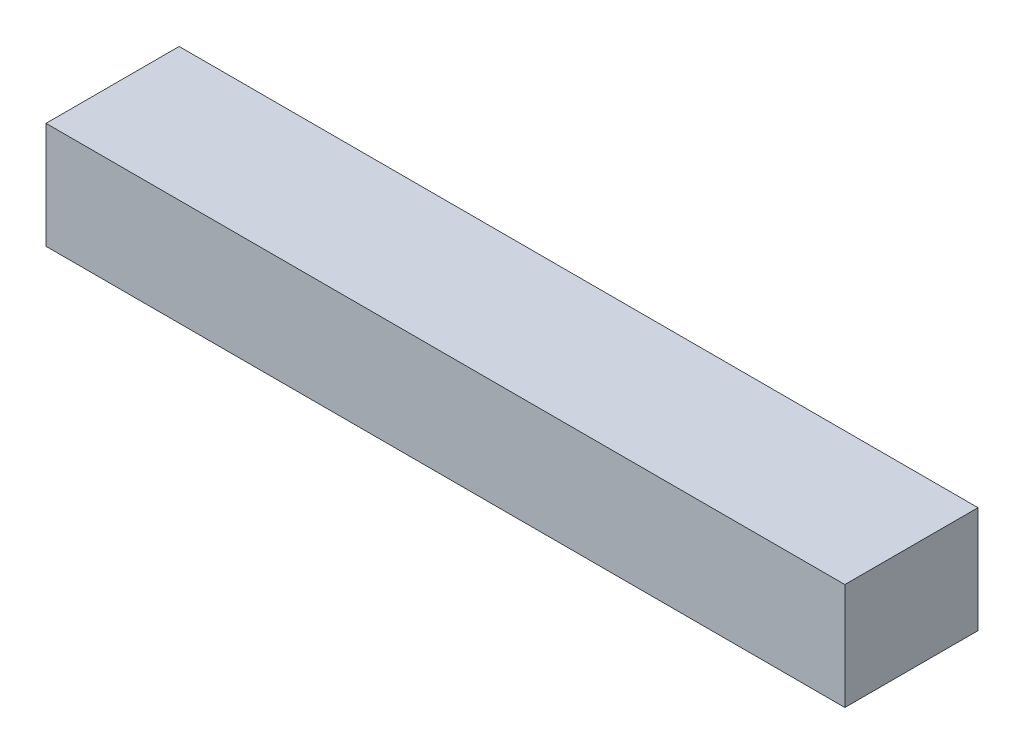
ISO-10303-21;
HEADER;
FILE_DESCRIPTION(('STEP AP214'),'2;1');
FILE_NAME('part.step','',(''),(''),'','','');
FILE_SCHEMA(('AUTOMOTIVE_DESIGN { 1 0 10303 214 1 1 1 1 }'));
ENDSEC;
DATA;
#1=APPLICATION_CONTEXT('core data for automotive mechanical design processes');
#2=APPLICATION_PROTOCOL_DEFINITION('international standard','automotive_design',2000,#1);
#3=PRODUCT_CONTEXT('',#1,'mechanical');
#4=PRODUCT('Part','Part','',(#3));
#5=PRODUCT_RELATED_PRODUCT_CATEGORY('part','',(#4));
#6=PRODUCT_DEFINITION_FORMATION('','',#4);
#7=PRODUCT_DEFINITION_CONTEXT('part definition',#1,'design');
#8=PRODUCT_DEFINITION('design','',#6,#7);
#9=PRODUCT_DEFINITION_SHAPE('','',#8);
#10=(LENGTH_UNIT() NAMED_UNIT(*) SI_UNIT(.MILLI.,.METRE.));
#11=(NAMED_UNIT(*) PLANE_ANGLE_UNIT() SI_UNIT($,.RADIAN.));
#12=(NAMED_UNIT(*) SI_UNIT($,.STERADIAN.) SOLID_ANGLE_UNIT());
#13=UNCERTAINTY_MEASURE_WITH_UNIT(LENGTH_MEASURE(1.E-05),#10,'distance_accuracy_value','');
#14=(GEOMETRIC_REPRESENTATION_CONTEXT(3) GLOBAL_UNCERTAINTY_ASSIGNED_CONTEXT((#13)) GLOBAL_UNIT_ASSIGNED_CONTEXT((#10,
#11,#12)) REPRESENTATION_CONTEXT('',''));
#15=CARTESIAN_POINT('',(0.,0.,0.));
#16=DIRECTION('',(0.,0.,1.));
#17=DIRECTION('',(1.,0.,0.));
#18=AXIS2_PLACEMENT_3D('',#15,#16,#17);
#19=CARTESIAN_POINT('',(0.,0.,500.));
#20=DIRECTION('',(1.,0.,0.));
#21=DIRECTION('',(0.,1.,0.));
#22=AXIS2_PLACEMENT_3D('',#19,#20,#21);
#23=PLANE('',#22);
#24=DIRECTION('',(0.,-1.,0.));
#25=VECTOR('',#24,1.);
#26=CARTESIAN_POINT('',(0.,0.,0.));
#27=LINE('',#26,#25);
#28=CARTESIAN_POINT('',(0.,0.,0.));
#29=VERTEX_POINT('',#28);
#30=CARTESIAN_POINT('',(0.,-400.,0.));
#31=VERTEX_POINT('',#30);
#32=EDGE_CURVE('E104',#29,#31,#27,.T.);
#33=ORIENTED_EDGE('',*,*,#32,.T.);
#34=DIRECTION('',(0.,0.,-1.));
#35=VECTOR('',#34,1.);
#36=CARTESIAN_POINT('',(0.,-400.,500.));
#37=LINE('',#36,#35);
#38=CARTESIAN_POINT('',(0.,-400.,500.));
#39=VERTEX_POINT('',#38);
#40=EDGE_CURVE('E95',#39,#31,#37,.T.);
#41=ORIENTED_EDGE('',*,*,#40,.F.);
#42=DIRECTION('',(0.,-1.,0.));
#43=VECTOR('',#42,1.);
#44=CARTESIAN_POINT('',(0.,0.,500.));
#45=LINE('',#44,#43);
#46=CARTESIAN_POINT('',(0.,0.,500.));
#47=VERTEX_POINT('',#46);
#48=EDGE_CURVE('E89',#47,#39,#45,.T.);
#49=ORIENTED_EDGE('',*,*,#48,.F.);
#50=DIRECTION('',(0.,0.,-1.));
#51=VECTOR('',#50,1.);
#52=CARTESIAN_POINT('',(0.,0.,500.));
#53=LINE('',#52,#51);
#54=EDGE_CURVE('E100',#47,#29,#53,.T.);
#55=ORIENTED_EDGE('',*,*,#54,.T.);
#56=EDGE_LOOP('',(#33,#41,#49,#55));
#57=FACE_BOUND('',#56,.T.);
#58=ADVANCED_FACE('F37',(#57),#23,.F.);
#59=CARTESIAN_POINT('',(0.,-400.,500.));
#60=DIRECTION('',(0.,1.,0.));
#61=DIRECTION('',(0.,0.,1.));
#62=AXIS2_PLACEMENT_3D('',#59,#60,#61);
#63=PLANE('',#62);
#64=CARTESIAN_POINT('',(1500.,-400.,250.));
#65=DIRECTION('',(0.,1.,0.));
#66=DIRECTION('',(0.,0.,1.));
#67=AXIS2_PLACEMENT_3D('',#64,#65,#66);
#68=CIRCLE('',#67,101.6);
#69=CARTESIAN_POINT('',(1500.,-400.,351.6));
#70=VERTEX_POINT('',#69);
#71=EDGE_CURVE('E11',#70,#70,#68,.F.);
#72=ORIENTED_EDGE('',*,*,#71,.F.);
#73=EDGE_LOOP('',(#72));
#74=FACE_BOUND('',#73,.T.);
#75=CARTESIAN_POINT('',(500.,-400.,250.));
#76=DIRECTION('',(0.,1.,0.));
#77=DIRECTION('',(0.,0.,1.));
#78=AXIS2_PLACEMENT_3D('',#75,#76,#77);
#79=CIRCLE('',#78,101.6);
#80=CARTESIAN_POINT('',(500.,-400.,351.6));
#81=VERTEX_POINT('',#80);
#82=EDGE_CURVE('E45',#81,#81,#79,.F.);
#83=ORIENTED_EDGE('',*,*,#82,.F.);
#84=EDGE_LOOP('',(#83));
#85=FACE_BOUND('',#84,.T.);
#86=CARTESIAN_POINT('',(2500.,-400.,250.));
#87=DIRECTION('',(0.,1.,0.));
#88=DIRECTION('',(0.,0.,1.));
#89=AXIS2_PLACEMENT_3D('',#86,#87,#88);
#90=CIRCLE('',#89,101.6);
#91=CARTESIAN_POINT('',(2500.,-400.,351.6));
#92=VERTEX_POINT('',#91);
#93=EDGE_CURVE('E114',#92,#92,#90,.F.);
#94=ORIENTED_EDGE('',*,*,#93,.F.);
#95=EDGE_LOOP('',(#94));
#96=FACE_BOUND('',#95,.T.);
#97=DIRECTION('',(1.,0.,0.));
#98=VECTOR('',#97,1.);
#99=CARTESIAN_POINT('',(0.,-400.,0.));
#100=LINE('',#99,#98);
#101=CARTESIAN_POINT('',(3000.,-400.,0.));
#102=VERTEX_POINT('',#101);
#103=EDGE_CURVE('E94',#31,#102,#100,.T.);
#104=ORIENTED_EDGE('',*,*,#103,.T.);
#105=DIRECTION('',(0.,0.,-1.));
#106=VECTOR('',#105,1.);
#107=CARTESIAN_POINT('',(3000.,-400.,500.));
#108=LINE('',#107,#106);
#109=CARTESIAN_POINT('',(3000.,-400.,500.));
#110=VERTEX_POINT('',#109);
#111=EDGE_CURVE('E92',#110,#102,#108,.T.);
#112=ORIENTED_EDGE('',*,*,#111,.F.);
#113=DIRECTION('',(1.,0.,0.));
#114=VECTOR('',#113,1.);
#115=CARTESIAN_POINT('',(0.,-400.,500.));
#116=LINE('',#115,#114);
#117=EDGE_CURVE('E84',#39,#110,#116,.T.);
#118=ORIENTED_EDGE('',*,*,#117,.F.);
#119=ORIENTED_EDGE('',*,*,#40,.T.);
#120=EDGE_LOOP('',(#104,#112,#118,#119));
#121=FACE_BOUND('',#120,.T.);
#122=ADVANCED_FACE('F93',(#74,#85,#96,#121),#63,.F.);
#123=CARTESIAN_POINT('',(3000.,0.,500.));
#124=DIRECTION('',(-1.,0.,0.));
#125=DIRECTION('',(0.,0.,1.));
#126=AXIS2_PLACEMENT_3D('',#123,#124,#125);
#127=PLANE('',#126);
#128=DIRECTION('',(0.,1.,0.));
#129=VECTOR('',#128,1.);
#130=CARTESIAN_POINT('',(3000.,0.,0.));
#131=LINE('',#130,#129);
#132=CARTESIAN_POINT('',(3000.,0.,0.));
#133=VERTEX_POINT('',#132);
#134=EDGE_CURVE('E70',#102,#133,#131,.T.);
#135=ORIENTED_EDGE('',*,*,#134,.T.);
#136=DIRECTION('',(0.,0.,-1.));
#137=VECTOR('',#136,1.);
#138=CARTESIAN_POINT('',(3000.,0.,500.));
#139=LINE('',#138,#137);
#140=CARTESIAN_POINT('',(3000.,0.,500.));
#141=VERTEX_POINT('',#140);
#142=EDGE_CURVE('E96',#141,#133,#139,.T.);
#143=ORIENTED_EDGE('',*,*,#142,.F.);
#144=DIRECTION('',(0.,1.,0.));
#145=VECTOR('',#144,1.);
#146=CARTESIAN_POINT('',(3000.,0.,500.));
#147=LINE('',#146,#145);
#148=EDGE_CURVE('E87',#110,#141,#147,.T.);
#149=ORIENTED_EDGE('',*,*,#148,.F.);
#150=ORIENTED_EDGE('',*,*,#111,.T.);
#151=EDGE_LOOP('',(#135,#143,#149,#150));
#152=FACE_BOUND('',#151,.T.);
#153=ADVANCED_FACE('F98',(#152),#127,.F.);
#154=CARTESIAN_POINT('',(0.,0.,500.));
#155=DIRECTION('',(0.,-1.,0.));
#156=DIRECTION('',(0.,0.,-1.));
#157=AXIS2_PLACEMENT_3D('',#154,#155,#156);
#158=PLANE('',#157);
#159=DIRECTION('',(-1.,0.,0.));
#160=VECTOR('',#159,1.);
#161=CARTESIAN_POINT('',(0.,0.,0.));
#162=LINE('',#161,#160);
#163=EDGE_CURVE('E76',#133,#29,#162,.T.);
#164=ORIENTED_EDGE('',*,*,#163,.T.);
#165=ORIENTED_EDGE('',*,*,#54,.F.);
#166=DIRECTION('',(-1.,0.,0.));
#167=VECTOR('',#166,1.);
#168=CARTESIAN_POINT('',(0.,0.,500.));
#169=LINE('',#168,#167);
#170=EDGE_CURVE('E53',#141,#47,#169,.T.);
#171=ORIENTED_EDGE('',*,*,#170,.F.);
#172=ORIENTED_EDGE('',*,*,#142,.T.);
#173=EDGE_LOOP('',(#164,#165,#171,#172));
#174=FACE_BOUND('',#173,.T.);
#175=ADVANCED_FACE('F147',(#174),#158,.F.);
#176=CARTESIAN_POINT('',(0.,0.,500.));
#177=DIRECTION('',(0.,0.,1.));
#178=DIRECTION('',(1.,0.,0.));
#179=AXIS2_PLACEMENT_3D('',#176,#177,#178);
#180=PLANE('',#179);
#181=ORIENTED_EDGE('',*,*,#48,.T.);
#182=ORIENTED_EDGE('',*,*,#117,.T.);
#183=ORIENTED_EDGE('',*,*,#148,.T.);
#184=ORIENTED_EDGE('',*,*,#170,.T.);
#185=EDGE_LOOP('',(#181,#182,#183,#184));
#186=FACE_BOUND('',#185,.T.);
#187=ADVANCED_FACE('F85',(#186),#180,.T.);
#188=CARTESIAN_POINT('',(0.,0.,0.));
#189=DIRECTION('',(0.,0.,1.));
#190=DIRECTION('',(1.,0.,0.));
#191=AXIS2_PLACEMENT_3D('',#188,#189,#190);
#192=PLANE('',#191);
#193=ORIENTED_EDGE('',*,*,#32,.F.);
#194=ORIENTED_EDGE('',*,*,#163,.F.);
#195=ORIENTED_EDGE('',*,*,#134,.F.);
#196=ORIENTED_EDGE('',*,*,#103,.F.);
#197=EDGE_LOOP('',(#193,#194,#195,#196));
#198=FACE_BOUND('',#197,.T.);
#199=ADVANCED_FACE('F129',(#198),#192,.F.);
#200=CARTESIAN_POINT('',(2500.,-420.,250.));
#201=DIRECTION('',(0.,1.,0.));
#202=DIRECTION('',(0.,0.,1.));
#203=AXIS2_PLACEMENT_3D('',#200,#201,#202);
#204=CYLINDRICAL_SURFACE('',#203,101.6);
#205=CARTESIAN_POINT('',(2500.,-420.,250.));
#206=DIRECTION('',(0.,-1.,0.));
#207=DIRECTION('',(0.,0.,-1.));
#208=AXIS2_PLACEMENT_3D('',#205,#206,#207);
#209=CIRCLE('',#208,101.6);
#210=CARTESIAN_POINT('',(2500.,-420.,148.4));
#211=VERTEX_POINT('',#210);
#212=EDGE_CURVE('E107',#211,#211,#209,.T.);
#213=ORIENTED_EDGE('',*,*,#212,.F.);
#214=EDGE_LOOP('',(#213));
#215=FACE_BOUND('',#214,.T.);
#216=ORIENTED_EDGE('',*,*,#93,.T.);
#217=EDGE_LOOP('',(#216));
#218=FACE_BOUND('',#217,.T.);
#219=ADVANCED_FACE('F126',(#215,#218),#204,.T.);
#220=CARTESIAN_POINT('',(2500.,-420.,250.));
#221=DIRECTION('',(0.,-1.,0.));
#222=DIRECTION('',(0.,0.,-1.));
#223=AXIS2_PLACEMENT_3D('',#220,#221,#222);
#224=PLANE('',#223);
#225=ORIENTED_EDGE('',*,*,#212,.T.);
#226=EDGE_LOOP('',(#225));
#227=FACE_BOUND('',#226,.T.);
#228=ADVANCED_FACE('F128',(#227),#224,.T.);
#229=CARTESIAN_POINT('',(500.,-420.,250.));
#230=DIRECTION('',(0.,1.,0.));
#231=DIRECTION('',(0.,0.,1.));
#232=AXIS2_PLACEMENT_3D('',#229,#230,#231);
#233=CYLINDRICAL_SURFACE('',#232,101.6);
#234=CARTESIAN_POINT('',(500.,-420.,250.));
#235=DIRECTION('',(0.,-1.,0.));
#236=DIRECTION('',(0.,0.,-1.));
#237=AXIS2_PLACEMENT_3D('',#234,#235,#236);
#238=CIRCLE('',#237,101.6);
#239=CARTESIAN_POINT('',(500.,-420.,148.4));
#240=VERTEX_POINT('',#239);
#241=EDGE_CURVE('E222',#240,#240,#238,.T.);
#242=ORIENTED_EDGE('',*,*,#241,.F.);
#243=EDGE_LOOP('',(#242));
#244=FACE_BOUND('',#243,.T.);
#245=ORIENTED_EDGE('',*,*,#82,.T.);
#246=EDGE_LOOP('',(#245));
#247=FACE_BOUND('',#246,.T.);
#248=ADVANCED_FACE('F119',(#244,#247),#233,.T.);
#249=CARTESIAN_POINT('',(500.,-420.,250.));
#250=DIRECTION('',(0.,-1.,0.));
#251=DIRECTION('',(0.,0.,-1.));
#252=AXIS2_PLACEMENT_3D('',#249,#250,#251);
#253=PLANE('',#252);
#254=ORIENTED_EDGE('',*,*,#241,.T.);
#255=EDGE_LOOP('',(#254));
#256=FACE_BOUND('',#255,.T.);
#257=ADVANCED_FACE('F185',(#256),#253,.T.);
#258=CARTESIAN_POINT('',(1500.,-420.,250.));
#259=DIRECTION('',(0.,1.,0.));
#260=DIRECTION('',(0.,0.,1.));
#261=AXIS2_PLACEMENT_3D('',#258,#259,#260);
#262=CYLINDRICAL_SURFACE('',#261,101.6);
#263=CARTESIAN_POINT('',(1500.,-420.,250.));
#264=DIRECTION('',(0.,-1.,0.));
#265=DIRECTION('',(0.,0.,-1.));
#266=AXIS2_PLACEMENT_3D('',#263,#264,#265);
#267=CIRCLE('',#266,101.6);
#268=CARTESIAN_POINT('',(1500.,-420.,148.4));
#269=VERTEX_POINT('',#268);
#270=EDGE_CURVE('E221',#269,#269,#267,.T.);
#271=ORIENTED_EDGE('',*,*,#270,.F.);
#272=EDGE_LOOP('',(#271));
#273=FACE_BOUND('',#272,.T.);
#274=ORIENTED_EDGE('',*,*,#71,.T.);
#275=EDGE_LOOP('',(#274));
#276=FACE_BOUND('',#275,.T.);
#277=ADVANCED_FACE('F195',(#273,#276),#262,.T.);
#278=CARTESIAN_POINT('',(1500.,-420.,250.));
#279=DIRECTION('',(0.,-1.,0.));
#280=DIRECTION('',(0.,0.,-1.));
#281=AXIS2_PLACEMENT_3D('',#278,#279,#280);
#282=PLANE('',#281);
#283=ORIENTED_EDGE('',*,*,#270,.T.);
#284=EDGE_LOOP('',(#283));
#285=FACE_BOUND('',#284,.T.);
#286=ADVANCED_FACE('F205',(#285),#282,.T.);
#287=CLOSED_SHELL('',(#58,#122,#153,#175,#187,#199,#219,#228,#248,#257,#277,#286));
#288=MANIFOLD_SOLID_BREP('B2',#287);
#289=ADVANCED_BREP_SHAPE_REPRESENTATION('',(#18,#288),#14);
#290=SHAPE_DEFINITION_REPRESENTATION(#9,#289);
ENDSEC;
END-ISO-10303-21;
